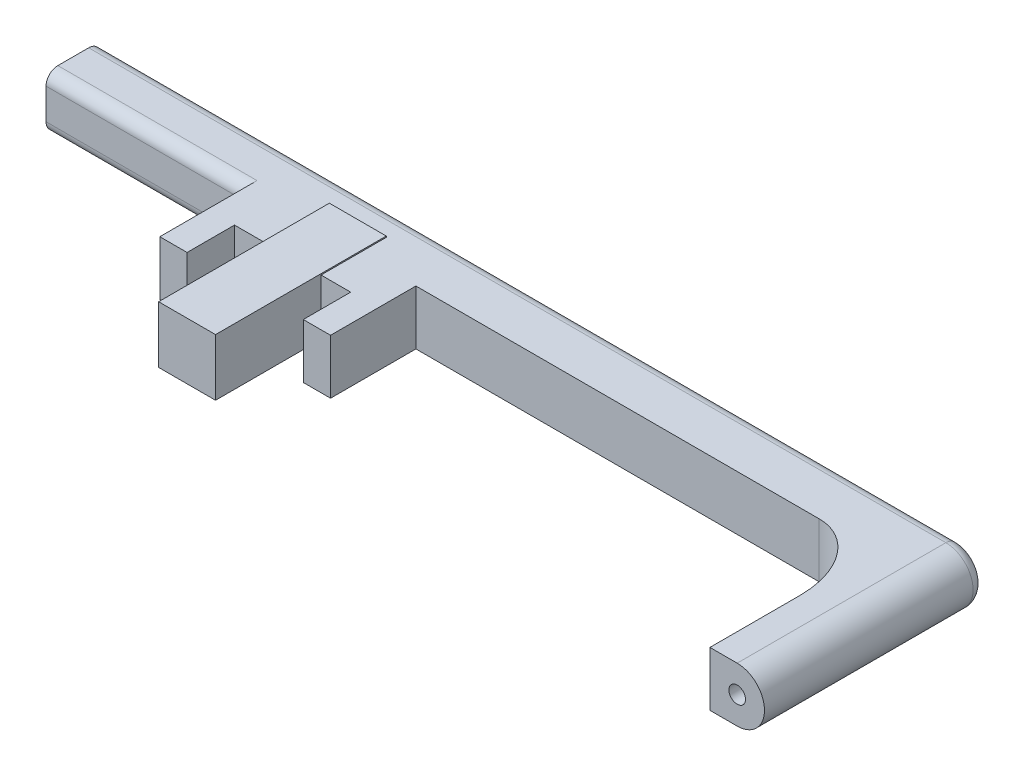
ISO-10303-21;
HEADER;
FILE_DESCRIPTION(('STEP AP214'),'2;1');
FILE_NAME('part.step','',(''),(''),'','','');
FILE_SCHEMA(('AUTOMOTIVE_DESIGN { 1 0 10303 214 1 1 1 1 }'));
ENDSEC;
DATA;
#1=APPLICATION_CONTEXT('core data for automotive mechanical design processes');
#2=APPLICATION_PROTOCOL_DEFINITION('international standard','automotive_design',2000,#1);
#3=PRODUCT_CONTEXT('',#1,'mechanical');
#4=PRODUCT('Part','Part','',(#3));
#5=PRODUCT_RELATED_PRODUCT_CATEGORY('part','',(#4));
#6=PRODUCT_DEFINITION_FORMATION('','',#4);
#7=PRODUCT_DEFINITION_CONTEXT('part definition',#1,'design');
#8=PRODUCT_DEFINITION('design','',#6,#7);
#9=PRODUCT_DEFINITION_SHAPE('','',#8);
#10=(LENGTH_UNIT() NAMED_UNIT(*) SI_UNIT(.MILLI.,.METRE.));
#11=(NAMED_UNIT(*) PLANE_ANGLE_UNIT() SI_UNIT($,.RADIAN.));
#12=(NAMED_UNIT(*) SI_UNIT($,.STERADIAN.) SOLID_ANGLE_UNIT());
#13=UNCERTAINTY_MEASURE_WITH_UNIT(LENGTH_MEASURE(1.E-05),#10,'distance_accuracy_value','');
#14=(GEOMETRIC_REPRESENTATION_CONTEXT(3) GLOBAL_UNCERTAINTY_ASSIGNED_CONTEXT((#13)) GLOBAL_UNIT_ASSIGNED_CONTEXT((#10,
#11,#12)) REPRESENTATION_CONTEXT('',''));
#15=CARTESIAN_POINT('',(0.,0.,0.));
#16=DIRECTION('',(0.,0.,1.));
#17=DIRECTION('',(1.,0.,0.));
#18=AXIS2_PLACEMENT_3D('',#15,#16,#17);
#19=CARTESIAN_POINT('',(1.2,-1.2,7.2));
#20=DIRECTION('',(-1.,0.,0.));
#21=DIRECTION('',(0.,0.,1.));
#22=AXIS2_PLACEMENT_3D('',#19,#20,#21);
#23=PLANE('',#22);
#24=DIRECTION('',(0.,-1.,0.));
#25=VECTOR('',#24,1.);
#26=CARTESIAN_POINT('',(1.2,-1.2,2.75));
#27=LINE('',#26,#25);
#28=CARTESIAN_POINT('',(1.2,1.15,2.75));
#29=VERTEX_POINT('',#28);
#30=CARTESIAN_POINT('',(1.2,-1.15,2.75));
#31=VERTEX_POINT('',#30);
#32=EDGE_CURVE('E527',#29,#31,#27,.T.);
#33=ORIENTED_EDGE('',*,*,#32,.F.);
#34=DIRECTION('',(0.,0.,-1.));
#35=VECTOR('',#34,1.);
#36=CARTESIAN_POINT('',(1.2,1.15,7.2));
#37=LINE('',#36,#35);
#38=CARTESIAN_POINT('',(1.2,1.15,0.));
#39=VERTEX_POINT('',#38);
#40=EDGE_CURVE('E249',#29,#39,#37,.T.);
#41=ORIENTED_EDGE('',*,*,#40,.T.);
#42=DIRECTION('',(0.,1.,0.));
#43=VECTOR('',#42,1.);
#44=CARTESIAN_POINT('',(1.2,-1.2,0.));
#45=LINE('',#44,#43);
#46=CARTESIAN_POINT('',(1.2,1.2,0.));
#47=VERTEX_POINT('',#46);
#48=EDGE_CURVE('E502',#39,#47,#45,.T.);
#49=ORIENTED_EDGE('',*,*,#48,.T.);
#50=DIRECTION('',(0.,0.,-1.));
#51=VECTOR('',#50,1.);
#52=CARTESIAN_POINT('',(1.2,1.2,7.2));
#53=LINE('',#52,#51);
#54=CARTESIAN_POINT('',(1.2,1.2,7.2));
#55=VERTEX_POINT('',#54);
#56=EDGE_CURVE('E477',#55,#47,#53,.T.);
#57=ORIENTED_EDGE('',*,*,#56,.F.);
#58=DIRECTION('',(0.,1.,0.));
#59=VECTOR('',#58,1.);
#60=CARTESIAN_POINT('',(1.2,-1.2,7.2));
#61=LINE('',#60,#59);
#62=CARTESIAN_POINT('',(1.2,-1.2,7.2));
#63=VERTEX_POINT('',#62);
#64=EDGE_CURVE('E493',#63,#55,#61,.T.);
#65=ORIENTED_EDGE('',*,*,#64,.F.);
#66=DIRECTION('',(0.,0.,-1.));
#67=VECTOR('',#66,1.);
#68=CARTESIAN_POINT('',(1.2,-1.2,7.2));
#69=LINE('',#68,#67);
#70=CARTESIAN_POINT('',(1.2,-1.2,0.));
#71=VERTEX_POINT('',#70);
#72=EDGE_CURVE('E487',#63,#71,#69,.T.);
#73=ORIENTED_EDGE('',*,*,#72,.T.);
#74=CARTESIAN_POINT('',(1.2,-1.15,0.));
#75=VERTEX_POINT('',#74);
#76=EDGE_CURVE('E499',#71,#75,#45,.T.);
#77=ORIENTED_EDGE('',*,*,#76,.T.);
#78=DIRECTION('',(0.,0.,1.));
#79=VECTOR('',#78,1.);
#80=CARTESIAN_POINT('',(1.2,-1.15,7.2));
#81=LINE('',#80,#79);
#82=EDGE_CURVE('E510',#75,#31,#81,.T.);
#83=ORIENTED_EDGE('',*,*,#82,.T.);
#84=EDGE_LOOP('',(#33,#41,#49,#57,#65,#73,#77,#83));
#85=FACE_BOUND('',#84,.T.);
#86=ADVANCED_FACE('F43',(#85),#23,.F.);
#87=CARTESIAN_POINT('',(-1.2,-1.2,7.2));
#88=DIRECTION('',(1.,0.,0.));
#89=DIRECTION('',(0.,0.,-1.));
#90=AXIS2_PLACEMENT_3D('',#87,#88,#89);
#91=PLANE('',#90);
#92=DIRECTION('',(0.,0.,1.));
#93=VECTOR('',#92,1.);
#94=CARTESIAN_POINT('',(-1.2,1.15,7.2));
#95=LINE('',#94,#93);
#96=CARTESIAN_POINT('',(-1.2,1.15,0.));
#97=VERTEX_POINT('',#96);
#98=CARTESIAN_POINT('',(-1.2,1.15,2.75));
#99=VERTEX_POINT('',#98);
#100=EDGE_CURVE('E61',#97,#99,#95,.T.);
#101=ORIENTED_EDGE('',*,*,#100,.T.);
#102=DIRECTION('',(0.,1.,0.));
#103=VECTOR('',#102,1.);
#104=CARTESIAN_POINT('',(-1.2,-1.2,2.75));
#105=LINE('',#104,#103);
#106=CARTESIAN_POINT('',(-1.2,-1.15,2.75));
#107=VERTEX_POINT('',#106);
#108=EDGE_CURVE('E529',#107,#99,#105,.T.);
#109=ORIENTED_EDGE('',*,*,#108,.F.);
#110=DIRECTION('',(0.,0.,-1.));
#111=VECTOR('',#110,1.);
#112=CARTESIAN_POINT('',(-1.2,-1.15,7.2));
#113=LINE('',#112,#111);
#114=CARTESIAN_POINT('',(-1.2,-1.15,0.));
#115=VERTEX_POINT('',#114);
#116=EDGE_CURVE('E69',#107,#115,#113,.T.);
#117=ORIENTED_EDGE('',*,*,#116,.T.);
#118=DIRECTION('',(0.,-1.,0.));
#119=VECTOR('',#118,1.);
#120=CARTESIAN_POINT('',(-1.2,-1.2,0.));
#121=LINE('',#120,#119);
#122=CARTESIAN_POINT('',(-1.2,-1.2,0.));
#123=VERTEX_POINT('',#122);
#124=EDGE_CURVE('E496',#115,#123,#121,.T.);
#125=ORIENTED_EDGE('',*,*,#124,.T.);
#126=DIRECTION('',(0.,0.,-1.));
#127=VECTOR('',#126,1.);
#128=CARTESIAN_POINT('',(-1.2,-1.2,7.2));
#129=LINE('',#128,#127);
#130=CARTESIAN_POINT('',(-1.2,-1.2,7.2));
#131=VERTEX_POINT('',#130);
#132=EDGE_CURVE('E484',#131,#123,#129,.T.);
#133=ORIENTED_EDGE('',*,*,#132,.F.);
#134=DIRECTION('',(0.,-1.,0.));
#135=VECTOR('',#134,1.);
#136=CARTESIAN_POINT('',(-1.2,-1.2,7.2));
#137=LINE('',#136,#135);
#138=CARTESIAN_POINT('',(-1.2,1.2,7.2));
#139=VERTEX_POINT('',#138);
#140=EDGE_CURVE('E504',#139,#131,#137,.T.);
#141=ORIENTED_EDGE('',*,*,#140,.F.);
#142=DIRECTION('',(0.,0.,-1.));
#143=VECTOR('',#142,1.);
#144=CARTESIAN_POINT('',(-1.2,1.2,7.2));
#145=LINE('',#144,#143);
#146=CARTESIAN_POINT('',(-1.2,1.2,0.));
#147=VERTEX_POINT('',#146);
#148=EDGE_CURVE('E479',#139,#147,#145,.T.);
#149=ORIENTED_EDGE('',*,*,#148,.T.);
#150=EDGE_CURVE('E494',#147,#97,#121,.T.);
#151=ORIENTED_EDGE('',*,*,#150,.T.);
#152=EDGE_LOOP('',(#101,#109,#117,#125,#133,#141,#149,#151));
#153=FACE_BOUND('',#152,.T.);
#154=ADVANCED_FACE('F605',(#153),#91,.F.);
#155=CARTESIAN_POINT('',(-2.45,0.,-0.65));
#156=DIRECTION('',(-1.,0.,0.));
#157=DIRECTION('',(0.,-1.,0.));
#158=AXIS2_PLACEMENT_3D('',#155,#156,#157);
#159=PLANE('',#158);
#160=DIRECTION('',(0.,-1.,0.));
#161=VECTOR('',#160,1.);
#162=CARTESIAN_POINT('',(-2.45,0.,2.75));
#163=LINE('',#162,#161);
#164=CARTESIAN_POINT('',(-2.45,1.15,2.75));
#165=VERTEX_POINT('',#164);
#166=CARTESIAN_POINT('',(-2.45,-1.15,2.75));
#167=VERTEX_POINT('',#166);
#168=EDGE_CURVE('E238',#165,#167,#163,.T.);
#169=ORIENTED_EDGE('',*,*,#168,.F.);
#170=DIRECTION('',(0.,0.,1.));
#171=VECTOR('',#170,1.);
#172=CARTESIAN_POINT('',(-2.45,1.15,-0.65));
#173=LINE('',#172,#171);
#174=CARTESIAN_POINT('',(-2.45,1.15,4.75));
#175=VERTEX_POINT('',#174);
#176=EDGE_CURVE('E284',#165,#175,#173,.T.);
#177=ORIENTED_EDGE('',*,*,#176,.T.);
#178=DIRECTION('',(0.,-1.,0.));
#179=VECTOR('',#178,1.);
#180=CARTESIAN_POINT('',(-2.45,0.,4.75));
#181=LINE('',#180,#179);
#182=CARTESIAN_POINT('',(-2.45,-1.15,4.75));
#183=VERTEX_POINT('',#182);
#184=EDGE_CURVE('E280',#175,#183,#181,.T.);
#185=ORIENTED_EDGE('',*,*,#184,.T.);
#186=DIRECTION('',(0.,0.,1.));
#187=VECTOR('',#186,1.);
#188=CARTESIAN_POINT('',(-2.45,-1.15,-0.65));
#189=LINE('',#188,#187);
#190=EDGE_CURVE('E287',#167,#183,#189,.T.);
#191=ORIENTED_EDGE('',*,*,#190,.F.);
#192=EDGE_LOOP('',(#169,#177,#185,#191));
#193=FACE_BOUND('',#192,.T.);
#194=ADVANCED_FACE('F541',(#193),#159,.F.);
#195=CARTESIAN_POINT('',(2.45,0.,4.75));
#196=DIRECTION('',(-1.,0.,0.));
#197=DIRECTION('',(0.,0.,1.));
#198=AXIS2_PLACEMENT_3D('',#195,#196,#197);
#199=PLANE('',#198);
#200=DIRECTION('',(0.,0.,-1.));
#201=VECTOR('',#200,1.);
#202=CARTESIAN_POINT('',(2.45,1.15,4.75));
#203=LINE('',#202,#201);
#204=CARTESIAN_POINT('',(2.45,1.15,4.75));
#205=VERTEX_POINT('',#204);
#206=CARTESIAN_POINT('',(2.45,1.15,2.75));
#207=VERTEX_POINT('',#206);
#208=EDGE_CURVE('E245',#205,#207,#203,.T.);
#209=ORIENTED_EDGE('',*,*,#208,.T.);
#210=DIRECTION('',(0.,-1.,0.));
#211=VECTOR('',#210,1.);
#212=CARTESIAN_POINT('',(2.45,0.,2.75));
#213=LINE('',#212,#211);
#214=CARTESIAN_POINT('',(2.45,-1.15,2.75));
#215=VERTEX_POINT('',#214);
#216=EDGE_CURVE('E227',#207,#215,#213,.T.);
#217=ORIENTED_EDGE('',*,*,#216,.T.);
#218=DIRECTION('',(0.,0.,-1.));
#219=VECTOR('',#218,1.);
#220=CARTESIAN_POINT('',(2.45,-1.15,4.75));
#221=LINE('',#220,#219);
#222=CARTESIAN_POINT('',(2.45,-1.15,4.75));
#223=VERTEX_POINT('',#222);
#224=EDGE_CURVE('E266',#223,#215,#221,.T.);
#225=ORIENTED_EDGE('',*,*,#224,.F.);
#226=DIRECTION('',(0.,1.,0.));
#227=VECTOR('',#226,1.);
#228=CARTESIAN_POINT('',(2.45,0.,4.75));
#229=LINE('',#228,#227);
#230=EDGE_CURVE('E254',#223,#205,#229,.T.);
#231=ORIENTED_EDGE('',*,*,#230,.T.);
#232=EDGE_LOOP('',(#209,#217,#225,#231));
#233=FACE_BOUND('',#232,.T.);
#234=ADVANCED_FACE('F252',(#233),#199,.T.);
#235=CARTESIAN_POINT('',(0.,0.,0.));
#236=DIRECTION('',(0.,0.,-1.));
#237=DIRECTION('',(-1.,0.,0.));
#238=AXIS2_PLACEMENT_3D('',#235,#236,#237);
#239=PLANE('',#238);
#240=DIRECTION('',(-1.,0.,0.));
#241=VECTOR('',#240,1.);
#242=CARTESIAN_POINT('',(0.,-1.15,0.));
#243=LINE('',#242,#241);
#244=EDGE_CURVE('E330',#75,#115,#243,.T.);
#245=ORIENTED_EDGE('',*,*,#244,.F.);
#246=ORIENTED_EDGE('',*,*,#76,.F.);
#247=DIRECTION('',(1.,0.,0.));
#248=VECTOR('',#247,1.);
#249=CARTESIAN_POINT('',(-1.2,-1.2,0.));
#250=LINE('',#249,#248);
#251=EDGE_CURVE('E491',#123,#71,#250,.T.);
#252=ORIENTED_EDGE('',*,*,#251,.F.);
#253=ORIENTED_EDGE('',*,*,#124,.F.);
#254=EDGE_LOOP('',(#245,#246,#252,#253));
#255=FACE_BOUND('',#254,.T.);
#256=ADVANCED_FACE('F615',(#255),#239,.T.);
#257=CARTESIAN_POINT('',(-1.2,1.2,7.2));
#258=DIRECTION('',(0.,-1.,0.));
#259=DIRECTION('',(0.,0.,-1.));
#260=AXIS2_PLACEMENT_3D('',#257,#258,#259);
#261=PLANE('',#260);
#262=DIRECTION('',(-1.,0.,0.));
#263=VECTOR('',#262,1.);
#264=CARTESIAN_POINT('',(-1.2,1.2,0.));
#265=LINE('',#264,#263);
#266=EDGE_CURVE('E497',#47,#147,#265,.T.);
#267=ORIENTED_EDGE('',*,*,#266,.T.);
#268=ORIENTED_EDGE('',*,*,#148,.F.);
#269=DIRECTION('',(-1.,0.,0.));
#270=VECTOR('',#269,1.);
#271=CARTESIAN_POINT('',(-1.2,1.2,7.2));
#272=LINE('',#271,#270);
#273=EDGE_CURVE('E506',#55,#139,#272,.T.);
#274=ORIENTED_EDGE('',*,*,#273,.F.);
#275=ORIENTED_EDGE('',*,*,#56,.T.);
#276=EDGE_LOOP('',(#267,#268,#274,#275));
#277=FACE_BOUND('',#276,.T.);
#278=ADVANCED_FACE('F631',(#277),#261,.F.);
#279=CARTESIAN_POINT('',(-1.2,-1.2,7.2));
#280=DIRECTION('',(0.,1.,0.));
#281=DIRECTION('',(0.,0.,1.));
#282=AXIS2_PLACEMENT_3D('',#279,#280,#281);
#283=PLANE('',#282);
#284=ORIENTED_EDGE('',*,*,#251,.T.);
#285=ORIENTED_EDGE('',*,*,#72,.F.);
#286=DIRECTION('',(1.,0.,0.));
#287=VECTOR('',#286,1.);
#288=CARTESIAN_POINT('',(-1.2,-1.2,7.2));
#289=LINE('',#288,#287);
#290=EDGE_CURVE('E490',#131,#63,#289,.T.);
#291=ORIENTED_EDGE('',*,*,#290,.F.);
#292=ORIENTED_EDGE('',*,*,#132,.T.);
#293=EDGE_LOOP('',(#284,#285,#291,#292));
#294=FACE_BOUND('',#293,.T.);
#295=ADVANCED_FACE('F621',(#294),#283,.F.);
#296=CARTESIAN_POINT('',(0.,0.,7.2));
#297=DIRECTION('',(0.,0.,-1.));
#298=DIRECTION('',(-1.,0.,0.));
#299=AXIS2_PLACEMENT_3D('',#296,#297,#298);
#300=PLANE('',#299);
#301=ORIENTED_EDGE('',*,*,#64,.T.);
#302=ORIENTED_EDGE('',*,*,#273,.T.);
#303=ORIENTED_EDGE('',*,*,#140,.T.);
#304=ORIENTED_EDGE('',*,*,#290,.T.);
#305=EDGE_LOOP('',(#301,#302,#303,#304));
#306=FACE_BOUND('',#305,.T.);
#307=ADVANCED_FACE('F623',(#306),#300,.F.);
#308=DIRECTION('',(1.,0.,0.));
#309=VECTOR('',#308,1.);
#310=CARTESIAN_POINT('',(0.,1.15,0.));
#311=LINE('',#310,#309);
#312=EDGE_CURVE('E475',#97,#39,#311,.T.);
#313=ORIENTED_EDGE('',*,*,#312,.F.);
#314=ORIENTED_EDGE('',*,*,#150,.F.);
#315=ORIENTED_EDGE('',*,*,#266,.F.);
#316=ORIENTED_EDGE('',*,*,#48,.F.);
#317=EDGE_LOOP('',(#313,#314,#315,#316));
#318=FACE_BOUND('',#317,.T.);
#319=ADVANCED_FACE('F630',(#318),#239,.T.);
#320=CARTESIAN_POINT('',(-12.,-1.15,1.15));
#321=DIRECTION('',(0.,0.,1.));
#322=DIRECTION('',(1.,0.,0.));
#323=AXIS2_PLACEMENT_3D('',#320,#321,#322);
#324=PLANE('',#323);
#325=DIRECTION('',(0.,1.,0.));
#326=VECTOR('',#325,1.);
#327=CARTESIAN_POINT('',(3.6,-1.15,1.15));
#328=LINE('',#327,#326);
#329=CARTESIAN_POINT('',(3.6,-1.15,1.15));
#330=VERTEX_POINT('',#329);
#331=CARTESIAN_POINT('',(3.6,1.15,1.15));
#332=VERTEX_POINT('',#331);
#333=EDGE_CURVE('E268',#330,#332,#328,.T.);
#334=ORIENTED_EDGE('',*,*,#333,.F.);
#335=DIRECTION('',(1.,0.,0.));
#336=VECTOR('',#335,1.);
#337=CARTESIAN_POINT('',(-12.,-1.15,1.15));
#338=LINE('',#337,#336);
#339=CARTESIAN_POINT('',(20.6,-1.15,1.15));
#340=VERTEX_POINT('',#339);
#341=EDGE_CURVE('E47',#330,#340,#338,.T.);
#342=ORIENTED_EDGE('',*,*,#341,.T.);
#343=CARTESIAN_POINT('',(20.6,1.265,1.15));
#344=CARTESIAN_POINT('',(20.6,0.421666666666668,1.15));
#345=CARTESIAN_POINT('',(20.6,-0.421666666666668,1.15));
#346=CARTESIAN_POINT('',(20.6,-1.265,1.15));
#347=(BOUNDED_CURVE() B_SPLINE_CURVE(3,(#343,#344,#345,#346),.UNSPECIFIED.,.F.,
.F.) B_SPLINE_CURVE_WITH_KNOTS((4,4),(-0.001265,0.001265),
.UNSPECIFIED.) CURVE() GEOMETRIC_REPRESENTATION_ITEM() RATIONAL_B_SPLINE_CURVE((1.,1.,1.,1.)) REPRESENTATION_ITEM(''));
#348=CARTESIAN_POINT('',(20.6,1.15,1.15));
#349=VERTEX_POINT('',#348);
#350=EDGE_CURVE('E462',#340,#349,#347,.F.);
#351=ORIENTED_EDGE('',*,*,#350,.T.);
#352=DIRECTION('',(1.,0.,0.));
#353=VECTOR('',#352,1.);
#354=CARTESIAN_POINT('',(-12.,1.15,1.15));
#355=LINE('',#354,#353);
#356=EDGE_CURVE('E352',#332,#349,#355,.T.);
#357=ORIENTED_EDGE('',*,*,#356,.F.);
#358=EDGE_LOOP('',(#334,#342,#351,#357));
#359=FACE_BOUND('',#358,.T.);
#360=ADVANCED_FACE('F514',(#359),#324,.T.);
#361=DIRECTION('',(0.,-1.,0.));
#362=VECTOR('',#361,1.);
#363=CARTESIAN_POINT('',(-3.6,-1.15,1.15));
#364=LINE('',#363,#362);
#365=CARTESIAN_POINT('',(-3.6,0.65,1.15));
#366=VERTEX_POINT('',#365);
#367=CARTESIAN_POINT('',(-3.6,-0.65,1.15));
#368=VERTEX_POINT('',#367);
#369=EDGE_CURVE('E286',#366,#368,#364,.T.);
#370=ORIENTED_EDGE('',*,*,#369,.F.);
#371=DIRECTION('',(1.,0.,0.));
#372=VECTOR('',#371,1.);
#373=CARTESIAN_POINT('',(-12.,0.65,1.15));
#374=LINE('',#373,#372);
#375=CARTESIAN_POINT('',(-12.,0.65,1.15));
#376=VERTEX_POINT('',#375);
#377=EDGE_CURVE('E370',#366,#376,#374,.F.);
#378=ORIENTED_EDGE('',*,*,#377,.T.);
#379=DIRECTION('',(0.,-1.,0.));
#380=VECTOR('',#379,1.);
#381=CARTESIAN_POINT('',(-12.,-1.15,1.15));
#382=LINE('',#381,#380);
#383=CARTESIAN_POINT('',(-12.,-0.65,1.15));
#384=VERTEX_POINT('',#383);
#385=EDGE_CURVE('E347',#376,#384,#382,.T.);
#386=ORIENTED_EDGE('',*,*,#385,.T.);
#387=DIRECTION('',(1.,0.,0.));
#388=VECTOR('',#387,1.);
#389=CARTESIAN_POINT('',(-12.,-0.65,1.15));
#390=LINE('',#389,#388);
#391=EDGE_CURVE('E367',#384,#368,#390,.T.);
#392=ORIENTED_EDGE('',*,*,#391,.T.);
#393=EDGE_LOOP('',(#370,#378,#386,#392));
#394=FACE_BOUND('',#393,.T.);
#395=ADVANCED_FACE('F563',(#394),#324,.T.);
#396=CARTESIAN_POINT('',(-12.,-1.15,1.15));
#397=DIRECTION('',(0.,-1.,0.));
#398=DIRECTION('',(0.,0.,-1.));
#399=AXIS2_PLACEMENT_3D('',#396,#397,#398);
#400=PLANE('',#399);
#401=DIRECTION('',(1.,0.,0.));
#402=VECTOR('',#401,1.);
#403=CARTESIAN_POINT('',(-12.,-1.15,-0.65));
#404=LINE('',#403,#402);
#405=CARTESIAN_POINT('',(-12.,-1.15,-0.65));
#406=VERTEX_POINT('',#405);
#407=CARTESIAN_POINT('',(24.15,-1.15,-0.65));
#408=VERTEX_POINT('',#407);
#409=EDGE_CURVE('E388',#406,#408,#404,.T.);
#410=ORIENTED_EDGE('',*,*,#409,.T.);
#411=DIRECTION('',(0.,0.,-1.));
#412=VECTOR('',#411,1.);
#413=CARTESIAN_POINT('',(24.15,-1.15,8.15));
#414=LINE('',#413,#412);
#415=CARTESIAN_POINT('',(24.15,-1.15,8.15));
#416=VERTEX_POINT('',#415);
#417=EDGE_CURVE('E337',#416,#408,#414,.T.);
#418=ORIENTED_EDGE('',*,*,#417,.F.);
#419=DIRECTION('',(1.,0.,0.));
#420=VECTOR('',#419,1.);
#421=CARTESIAN_POINT('',(23.,-1.15,8.15));
#422=LINE('',#421,#420);
#423=CARTESIAN_POINT('',(23.,-1.15,8.15));
#424=VERTEX_POINT('',#423);
#425=EDGE_CURVE('E314',#424,#416,#422,.T.);
#426=ORIENTED_EDGE('',*,*,#425,.F.);
#427=DIRECTION('',(0.,0.,-1.));
#428=VECTOR('',#427,1.);
#429=CARTESIAN_POINT('',(23.,-1.15,8.15));
#430=LINE('',#429,#428);
#431=CARTESIAN_POINT('',(23.,-1.15,4.35));
#432=VERTEX_POINT('',#431);
#433=EDGE_CURVE('E332',#424,#432,#430,.T.);
#434=ORIENTED_EDGE('',*,*,#433,.T.);
#435=CARTESIAN_POINT('',(20.6,-1.15,1.15));
#436=CARTESIAN_POINT('',(23.,-1.15,1.15));
#437=CARTESIAN_POINT('',(23.,-1.15,4.35));
#438=(BOUNDED_CURVE() B_SPLINE_CURVE(2,(#435,#436,#437),.UNSPECIFIED.,.F.,
.F.) B_SPLINE_CURVE_WITH_KNOTS((3,3),(0.,1.),
.UNSPECIFIED.) CURVE() GEOMETRIC_REPRESENTATION_ITEM() RATIONAL_B_SPLINE_CURVE((1.,
0.707106781186548,1.)) REPRESENTATION_ITEM(''));
#439=EDGE_CURVE('E466',#432,#340,#438,.F.);
#440=ORIENTED_EDGE('',*,*,#439,.T.);
#441=ORIENTED_EDGE('',*,*,#341,.F.);
#442=DIRECTION('',(0.,0.,-1.));
#443=VECTOR('',#442,1.);
#444=CARTESIAN_POINT('',(3.6,-1.15,4.75));
#445=LINE('',#444,#443);
#446=CARTESIAN_POINT('',(3.6,-1.15,4.75));
#447=VERTEX_POINT('',#446);
#448=EDGE_CURVE('E259',#447,#330,#445,.T.);
#449=ORIENTED_EDGE('',*,*,#448,.F.);
#450=DIRECTION('',(1.,0.,0.));
#451=VECTOR('',#450,1.);
#452=CARTESIAN_POINT('',(0.,-1.15,4.75));
#453=LINE('',#452,#451);
#454=EDGE_CURVE('E519',#223,#447,#453,.T.);
#455=ORIENTED_EDGE('',*,*,#454,.F.);
#456=ORIENTED_EDGE('',*,*,#224,.T.);
#457=DIRECTION('',(1.,0.,0.));
#458=VECTOR('',#457,1.);
#459=CARTESIAN_POINT('',(-3.6,-1.15,2.75));
#460=LINE('',#459,#458);
#461=EDGE_CURVE('E234',#31,#215,#460,.T.);
#462=ORIENTED_EDGE('',*,*,#461,.F.);
#463=ORIENTED_EDGE('',*,*,#82,.F.);
#464=ORIENTED_EDGE('',*,*,#244,.T.);
#465=ORIENTED_EDGE('',*,*,#116,.F.);
#466=EDGE_CURVE('E239',#167,#107,#460,.T.);
#467=ORIENTED_EDGE('',*,*,#466,.F.);
#468=ORIENTED_EDGE('',*,*,#190,.T.);
#469=DIRECTION('',(1.,0.,0.));
#470=VECTOR('',#469,1.);
#471=CARTESIAN_POINT('',(0.,-1.15,4.75));
#472=LINE('',#471,#470);
#473=CARTESIAN_POINT('',(-3.6,-1.15,4.75));
#474=VERTEX_POINT('',#473);
#475=EDGE_CURVE('E277',#474,#183,#472,.T.);
#476=ORIENTED_EDGE('',*,*,#475,.F.);
#477=DIRECTION('',(0.,0.,1.));
#478=VECTOR('',#477,1.);
#479=CARTESIAN_POINT('',(-3.6,-1.15,-0.65));
#480=LINE('',#479,#478);
#481=CARTESIAN_POINT('',(-3.6,-1.15,0.65));
#482=VERTEX_POINT('',#481);
#483=EDGE_CURVE('E289',#482,#474,#480,.T.);
#484=ORIENTED_EDGE('',*,*,#483,.F.);
#485=DIRECTION('',(1.,0.,0.));
#486=VECTOR('',#485,1.);
#487=CARTESIAN_POINT('',(-12.,-1.15,0.65));
#488=LINE('',#487,#486);
#489=CARTESIAN_POINT('',(-12.,-1.15,0.65));
#490=VERTEX_POINT('',#489);
#491=EDGE_CURVE('E390',#482,#490,#488,.F.);
#492=ORIENTED_EDGE('',*,*,#491,.T.);
#493=DIRECTION('',(0.,0.,-1.));
#494=VECTOR('',#493,1.);
#495=CARTESIAN_POINT('',(-12.,-1.15,1.15));
#496=LINE('',#495,#494);
#497=EDGE_CURVE('E350',#490,#406,#496,.T.);
#498=ORIENTED_EDGE('',*,*,#497,.T.);
#499=EDGE_LOOP('',(#410,#418,#426,#434,#440,#441,#449,#455,#456,#462,#463,#464,#465,#467,#468,
#476,#484,#492,#498));
#500=FACE_BOUND('',#499,.T.);
#501=ADVANCED_FACE('F516',(#500),#400,.T.);
#502=CARTESIAN_POINT('',(-12.,1.15,1.15));
#503=DIRECTION('',(0.,1.,0.));
#504=DIRECTION('',(0.,0.,1.));
#505=AXIS2_PLACEMENT_3D('',#502,#503,#504);
#506=PLANE('',#505);
#507=DIRECTION('',(-1.,0.,0.));
#508=VECTOR('',#507,1.);
#509=CARTESIAN_POINT('',(-3.6,1.15,2.75));
#510=LINE('',#509,#508);
#511=EDGE_CURVE('E250',#99,#165,#510,.T.);
#512=ORIENTED_EDGE('',*,*,#511,.F.);
#513=ORIENTED_EDGE('',*,*,#100,.F.);
#514=ORIENTED_EDGE('',*,*,#312,.T.);
#515=ORIENTED_EDGE('',*,*,#40,.F.);
#516=EDGE_CURVE('E231',#207,#29,#510,.T.);
#517=ORIENTED_EDGE('',*,*,#516,.F.);
#518=ORIENTED_EDGE('',*,*,#208,.F.);
#519=DIRECTION('',(1.,0.,0.));
#520=VECTOR('',#519,1.);
#521=CARTESIAN_POINT('',(0.,1.15,4.75));
#522=LINE('',#521,#520);
#523=CARTESIAN_POINT('',(3.6,1.15,4.75));
#524=VERTEX_POINT('',#523);
#525=EDGE_CURVE('E257',#205,#524,#522,.T.);
#526=ORIENTED_EDGE('',*,*,#525,.T.);
#527=DIRECTION('',(0.,0.,-1.));
#528=VECTOR('',#527,1.);
#529=CARTESIAN_POINT('',(3.6,1.15,4.75));
#530=LINE('',#529,#528);
#531=EDGE_CURVE('E256',#524,#332,#530,.T.);
#532=ORIENTED_EDGE('',*,*,#531,.T.);
#533=ORIENTED_EDGE('',*,*,#356,.T.);
#534=CARTESIAN_POINT('',(23.,1.15,4.35));
#535=CARTESIAN_POINT('',(23.,1.15,1.15));
#536=CARTESIAN_POINT('',(20.6,1.15,1.15));
#537=(BOUNDED_CURVE() B_SPLINE_CURVE(2,(#534,#535,#536),.UNSPECIFIED.,.F.,
.F.) B_SPLINE_CURVE_WITH_KNOTS((3,3),(0.,1.),
.UNSPECIFIED.) CURVE() GEOMETRIC_REPRESENTATION_ITEM() RATIONAL_B_SPLINE_CURVE((1.,
0.707106781186548,1.)) REPRESENTATION_ITEM(''));
#538=CARTESIAN_POINT('',(23.,1.15,4.35));
#539=VERTEX_POINT('',#538);
#540=EDGE_CURVE('E392',#349,#539,#537,.F.);
#541=ORIENTED_EDGE('',*,*,#540,.T.);
#542=DIRECTION('',(0.,0.,-1.));
#543=VECTOR('',#542,1.);
#544=CARTESIAN_POINT('',(23.,1.15,8.15));
#545=LINE('',#544,#543);
#546=CARTESIAN_POINT('',(23.,1.15,8.15));
#547=VERTEX_POINT('',#546);
#548=EDGE_CURVE('E321',#547,#539,#545,.T.);
#549=ORIENTED_EDGE('',*,*,#548,.F.);
#550=DIRECTION('',(-1.,0.,0.));
#551=VECTOR('',#550,1.);
#552=CARTESIAN_POINT('',(23.,1.15,8.15));
#553=LINE('',#552,#551);
#554=CARTESIAN_POINT('',(24.15,1.15,8.15));
#555=VERTEX_POINT('',#554);
#556=EDGE_CURVE('E318',#555,#547,#553,.T.);
#557=ORIENTED_EDGE('',*,*,#556,.F.);
#558=DIRECTION('',(0.,0.,-1.));
#559=VECTOR('',#558,1.);
#560=CARTESIAN_POINT('',(24.15,1.15,8.15));
#561=LINE('',#560,#559);
#562=CARTESIAN_POINT('',(24.15,1.15,-0.65));
#563=VERTEX_POINT('',#562);
#564=EDGE_CURVE('E324',#555,#563,#561,.T.);
#565=ORIENTED_EDGE('',*,*,#564,.T.);
#566=DIRECTION('',(1.,0.,0.));
#567=VECTOR('',#566,1.);
#568=CARTESIAN_POINT('',(-12.,1.15,-0.65));
#569=LINE('',#568,#567);
#570=CARTESIAN_POINT('',(-12.,1.15,-0.65));
#571=VERTEX_POINT('',#570);
#572=EDGE_CURVE('E365',#563,#571,#569,.F.);
#573=ORIENTED_EDGE('',*,*,#572,.T.);
#574=DIRECTION('',(0.,0.,1.));
#575=VECTOR('',#574,1.);
#576=CARTESIAN_POINT('',(-12.,1.15,1.15));
#577=LINE('',#576,#575);
#578=CARTESIAN_POINT('',(-12.,1.15,0.65));
#579=VERTEX_POINT('',#578);
#580=EDGE_CURVE('E344',#571,#579,#577,.T.);
#581=ORIENTED_EDGE('',*,*,#580,.T.);
#582=DIRECTION('',(1.,0.,0.));
#583=VECTOR('',#582,1.);
#584=CARTESIAN_POINT('',(-12.,1.15,0.65));
#585=LINE('',#584,#583);
#586=CARTESIAN_POINT('',(-3.6,1.15,0.65));
#587=VERTEX_POINT('',#586);
#588=EDGE_CURVE('E53',#579,#587,#585,.T.);
#589=ORIENTED_EDGE('',*,*,#588,.T.);
#590=DIRECTION('',(0.,0.,1.));
#591=VECTOR('',#590,1.);
#592=CARTESIAN_POINT('',(-3.6,1.15,-0.65));
#593=LINE('',#592,#591);
#594=CARTESIAN_POINT('',(-3.6,1.15,4.75));
#595=VERTEX_POINT('',#594);
#596=EDGE_CURVE('E283',#587,#595,#593,.T.);
#597=ORIENTED_EDGE('',*,*,#596,.T.);
#598=DIRECTION('',(1.,0.,0.));
#599=VECTOR('',#598,1.);
#600=CARTESIAN_POINT('',(0.,1.15,4.75));
#601=LINE('',#600,#599);
#602=EDGE_CURVE('E271',#595,#175,#601,.T.);
#603=ORIENTED_EDGE('',*,*,#602,.T.);
#604=ORIENTED_EDGE('',*,*,#176,.F.);
#605=EDGE_LOOP('',(#512,#513,#514,#515,#517,#518,#526,#532,#533,#541,#549,#557,#565,#573,#581,
#589,#597,#603,#604));
#606=FACE_BOUND('',#605,.T.);
#607=ADVANCED_FACE('F243',(#606),#506,.T.);
#608=CARTESIAN_POINT('',(-12.,-1.15,-1.15));
#609=DIRECTION('',(0.,0.,-1.));
#610=DIRECTION('',(-1.,0.,0.));
#611=AXIS2_PLACEMENT_3D('',#608,#609,#610);
#612=PLANE('',#611);
#613=CARTESIAN_POINT('',(24.15,0.,-1.15));
#614=DIRECTION('',(0.,0.,-1.));
#615=DIRECTION('',(-1.,0.,0.));
#616=AXIS2_PLACEMENT_3D('',#613,#614,#615);
#617=CIRCLE('',#616,0.65);
#618=CARTESIAN_POINT('',(24.15,0.65,-1.15));
#619=VERTEX_POINT('',#618);
#620=CARTESIAN_POINT('',(24.15,-0.65,-1.15));
#621=VERTEX_POINT('',#620);
#622=EDGE_CURVE('E384',#619,#621,#617,.T.);
#623=ORIENTED_EDGE('',*,*,#622,.T.);
#624=DIRECTION('',(1.,0.,0.));
#625=VECTOR('',#624,1.);
#626=CARTESIAN_POINT('',(-12.,-0.65,-1.15));
#627=LINE('',#626,#625);
#628=CARTESIAN_POINT('',(-12.,-0.65,-1.15));
#629=VERTEX_POINT('',#628);
#630=EDGE_CURVE('E382',#621,#629,#627,.F.);
#631=ORIENTED_EDGE('',*,*,#630,.T.);
#632=DIRECTION('',(0.,1.,0.));
#633=VECTOR('',#632,1.);
#634=CARTESIAN_POINT('',(-12.,-1.15,-1.15));
#635=LINE('',#634,#633);
#636=CARTESIAN_POINT('',(-12.,0.65,-1.15));
#637=VERTEX_POINT('',#636);
#638=EDGE_CURVE('E336',#629,#637,#635,.T.);
#639=ORIENTED_EDGE('',*,*,#638,.T.);
#640=DIRECTION('',(1.,0.,0.));
#641=VECTOR('',#640,1.);
#642=CARTESIAN_POINT('',(-12.,0.65,-1.15));
#643=LINE('',#642,#641);
#644=EDGE_CURVE('E386',#637,#619,#643,.T.);
#645=ORIENTED_EDGE('',*,*,#644,.T.);
#646=EDGE_LOOP('',(#623,#631,#639,#645));
#647=FACE_BOUND('',#646,.T.);
#648=CARTESIAN_POINT('',(24.15,0.,-1.15));
#649=DIRECTION('',(0.,0.,-1.));
#650=DIRECTION('',(-1.,0.,0.));
#651=AXIS2_PLACEMENT_3D('',#648,#649,#650);
#652=CIRCLE('',#651,0.350000000000001);
#653=CARTESIAN_POINT('',(23.8,0.,-1.15));
#654=VERTEX_POINT('',#653);
#655=EDGE_CURVE('E304',#654,#654,#652,.F.);
#656=ORIENTED_EDGE('',*,*,#655,.T.);
#657=EDGE_LOOP('',(#656));
#658=FACE_BOUND('',#657,.T.);
#659=ADVANCED_FACE('F576',(#647,#658),#612,.T.);
#660=CARTESIAN_POINT('',(-12.,0.,0.));
#661=DIRECTION('',(-1.,0.,0.));
#662=DIRECTION('',(0.,0.,1.));
#663=AXIS2_PLACEMENT_3D('',#660,#661,#662);
#664=PLANE('',#663);
#665=CARTESIAN_POINT('',(-12.,0.,0.));
#666=DIRECTION('',(-1.,0.,0.));
#667=DIRECTION('',(0.,0.,1.));
#668=AXIS2_PLACEMENT_3D('',#665,#666,#667);
#669=CIRCLE('',#668,0.35);
#670=CARTESIAN_POINT('',(-12.,0.,0.35));
#671=VERTEX_POINT('',#670);
#672=EDGE_CURVE('E301',#671,#671,#669,.T.);
#673=ORIENTED_EDGE('',*,*,#672,.F.);
#674=EDGE_LOOP('',(#673));
#675=FACE_BOUND('',#674,.T.);
#676=ORIENTED_EDGE('',*,*,#638,.F.);
#677=CARTESIAN_POINT('',(-12.,-0.65,-0.65));
#678=DIRECTION('',(-1.,0.,0.));
#679=DIRECTION('',(0.,0.,1.));
#680=AXIS2_PLACEMENT_3D('',#677,#678,#679);
#681=CIRCLE('',#680,0.5);
#682=EDGE_CURVE('E374',#629,#406,#681,.T.);
#683=ORIENTED_EDGE('',*,*,#682,.T.);
#684=ORIENTED_EDGE('',*,*,#497,.F.);
#685=CARTESIAN_POINT('',(-12.,-0.65,0.65));
#686=DIRECTION('',(-1.,0.,0.));
#687=DIRECTION('',(0.,0.,1.));
#688=AXIS2_PLACEMENT_3D('',#685,#686,#687);
#689=CIRCLE('',#688,0.5);
#690=EDGE_CURVE('E376',#490,#384,#689,.T.);
#691=ORIENTED_EDGE('',*,*,#690,.T.);
#692=ORIENTED_EDGE('',*,*,#385,.F.);
#693=CARTESIAN_POINT('',(-12.,0.65,0.65));
#694=DIRECTION('',(-1.,0.,0.));
#695=DIRECTION('',(0.,0.,1.));
#696=AXIS2_PLACEMENT_3D('',#693,#694,#695);
#697=CIRCLE('',#696,0.5);
#698=EDGE_CURVE('E378',#376,#579,#697,.T.);
#699=ORIENTED_EDGE('',*,*,#698,.T.);
#700=ORIENTED_EDGE('',*,*,#580,.F.);
#701=CARTESIAN_POINT('',(-12.,0.65,-0.65));
#702=DIRECTION('',(-1.,0.,0.));
#703=DIRECTION('',(0.,0.,1.));
#704=AXIS2_PLACEMENT_3D('',#701,#702,#703);
#705=CIRCLE('',#704,0.5);
#706=EDGE_CURVE('E380',#571,#637,#705,.T.);
#707=ORIENTED_EDGE('',*,*,#706,.T.);
#708=EDGE_LOOP('',(#676,#683,#684,#691,#692,#699,#700,#707));
#709=FACE_BOUND('',#708,.T.);
#710=ADVANCED_FACE('F556',(#675,#709),#664,.T.);
#711=CARTESIAN_POINT('',(23.,0.,8.15));
#712=DIRECTION('',(1.,0.,0.));
#713=DIRECTION('',(0.,0.,-1.));
#714=AXIS2_PLACEMENT_3D('',#711,#712,#713);
#715=PLANE('',#714);
#716=ORIENTED_EDGE('',*,*,#548,.T.);
#717=CARTESIAN_POINT('',(23.,-1.265,4.35));
#718=CARTESIAN_POINT('',(23.,-0.421666666666668,4.35));
#719=CARTESIAN_POINT('',(23.,0.421666666666668,4.35));
#720=CARTESIAN_POINT('',(23.,1.265,4.35));
#721=(BOUNDED_CURVE() B_SPLINE_CURVE(3,(#717,#718,#719,#720),.UNSPECIFIED.,.F.,
.F.) B_SPLINE_CURVE_WITH_KNOTS((4,4),(-0.001265,0.001265),
.UNSPECIFIED.) CURVE() GEOMETRIC_REPRESENTATION_ITEM() RATIONAL_B_SPLINE_CURVE((1.,1.,1.,1.)) REPRESENTATION_ITEM(''));
#722=EDGE_CURVE('E463',#539,#432,#721,.F.);
#723=ORIENTED_EDGE('',*,*,#722,.T.);
#724=ORIENTED_EDGE('',*,*,#433,.F.);
#725=DIRECTION('',(0.,-1.,0.));
#726=VECTOR('',#725,1.);
#727=CARTESIAN_POINT('',(23.,0.,8.15));
#728=LINE('',#727,#726);
#729=EDGE_CURVE('E311',#547,#424,#728,.T.);
#730=ORIENTED_EDGE('',*,*,#729,.F.);
#731=EDGE_LOOP('',(#716,#723,#724,#730));
#732=FACE_BOUND('',#731,.T.);
#733=ADVANCED_FACE('F592',(#732),#715,.F.);
#734=CARTESIAN_POINT('',(24.15,0.,8.15));
#735=DIRECTION('',(0.,0.,1.));
#736=DIRECTION('',(1.,0.,0.));
#737=AXIS2_PLACEMENT_3D('',#734,#735,#736);
#738=PLANE('',#737);
#739=ORIENTED_EDGE('',*,*,#729,.T.);
#740=ORIENTED_EDGE('',*,*,#425,.T.);
#741=CARTESIAN_POINT('',(24.15,0.,8.15));
#742=DIRECTION('',(0.,0.,1.));
#743=DIRECTION('',(1.,0.,0.));
#744=AXIS2_PLACEMENT_3D('',#741,#742,#743);
#745=CIRCLE('',#744,1.15);
#746=EDGE_CURVE('E316',#416,#555,#745,.T.);
#747=ORIENTED_EDGE('',*,*,#746,.T.);
#748=ORIENTED_EDGE('',*,*,#556,.T.);
#749=EDGE_LOOP('',(#739,#740,#747,#748));
#750=FACE_BOUND('',#749,.T.);
#751=CARTESIAN_POINT('',(24.15,0.,8.15));
#752=DIRECTION('',(0.,0.,1.));
#753=DIRECTION('',(1.,0.,0.));
#754=AXIS2_PLACEMENT_3D('',#751,#752,#753);
#755=CIRCLE('',#754,0.350000000000001);
#756=CARTESIAN_POINT('',(24.5,0.,8.15));
#757=VERTEX_POINT('',#756);
#758=EDGE_CURVE('E308',#757,#757,#755,.T.);
#759=ORIENTED_EDGE('',*,*,#758,.F.);
#760=EDGE_LOOP('',(#759));
#761=FACE_BOUND('',#760,.T.);
#762=ADVANCED_FACE('F590',(#750,#761),#738,.T.);
#763=CARTESIAN_POINT('',(24.15,0.,8.15));
#764=DIRECTION('',(0.,0.,-1.));
#765=DIRECTION('',(-1.,0.,0.));
#766=AXIS2_PLACEMENT_3D('',#763,#764,#765);
#767=CYLINDRICAL_SURFACE('',#766,1.15);
#768=ORIENTED_EDGE('',*,*,#417,.T.);
#769=CARTESIAN_POINT('',(24.15,0.,-0.65));
#770=DIRECTION('',(0.,0.,-1.));
#771=DIRECTION('',(-1.,0.,0.));
#772=AXIS2_PLACEMENT_3D('',#769,#770,#771);
#773=CIRCLE('',#772,1.15);
#774=EDGE_CURVE('E372',#408,#563,#773,.F.);
#775=ORIENTED_EDGE('',*,*,#774,.T.);
#776=ORIENTED_EDGE('',*,*,#564,.F.);
#777=ORIENTED_EDGE('',*,*,#746,.F.);
#778=EDGE_LOOP('',(#768,#775,#776,#777));
#779=FACE_BOUND('',#778,.T.);
#780=ADVANCED_FACE('F587',(#779),#767,.T.);
#781=CARTESIAN_POINT('',(24.15,0.,8.15));
#782=DIRECTION('',(0.,0.,-1.));
#783=DIRECTION('',(-1.,0.,0.));
#784=AXIS2_PLACEMENT_3D('',#781,#782,#783);
#785=CYLINDRICAL_SURFACE('',#784,0.350000000000001);
#786=ORIENTED_EDGE('',*,*,#758,.T.);
#787=EDGE_LOOP('',(#786));
#788=FACE_BOUND('',#787,.T.);
#789=ORIENTED_EDGE('',*,*,#655,.F.);
#790=EDGE_LOOP('',(#789));
#791=FACE_BOUND('',#790,.T.);
#792=ADVANCED_FACE('F670',(#788,#791),#785,.F.);
#793=CARTESIAN_POINT('',(-2.,0.,0.));
#794=DIRECTION('',(-1.,0.,0.));
#795=DIRECTION('',(0.,0.,1.));
#796=AXIS2_PLACEMENT_3D('',#793,#794,#795);
#797=CYLINDRICAL_SURFACE('',#796,0.35);
#798=CARTESIAN_POINT('',(-3.6,0.,0.));
#799=DIRECTION('',(-1.,0.,0.));
#800=DIRECTION('',(0.,-1.,0.));
#801=AXIS2_PLACEMENT_3D('',#798,#799,#800);
#802=CIRCLE('',#801,0.35);
#803=CARTESIAN_POINT('',(-3.6,-0.35,0.));
#804=VERTEX_POINT('',#803);
#805=EDGE_CURVE('E297',#804,#804,#802,.F.);
#806=ORIENTED_EDGE('',*,*,#805,.T.);
#807=EDGE_LOOP('',(#806));
#808=FACE_BOUND('',#807,.T.);
#809=ORIENTED_EDGE('',*,*,#672,.T.);
#810=EDGE_LOOP('',(#809));
#811=FACE_BOUND('',#810,.T.);
#812=ADVANCED_FACE('F414',(#808,#811),#797,.F.);
#813=CARTESIAN_POINT('',(23.,1.265,4.35));
#814=CARTESIAN_POINT('',(23.,0.421666666666668,4.35));
#815=CARTESIAN_POINT('',(23.,-0.421666666666668,4.35));
#816=CARTESIAN_POINT('',(23.,-1.265,4.35));
#817=CARTESIAN_POINT('',(23.,1.265,1.15));
#818=CARTESIAN_POINT('',(23.,0.421666666666668,1.15));
#819=CARTESIAN_POINT('',(23.,-0.421666666666668,1.15));
#820=CARTESIAN_POINT('',(23.,-1.265,1.15));
#821=CARTESIAN_POINT('',(20.6,1.265,1.15));
#822=CARTESIAN_POINT('',(20.6,0.421666666666668,1.15));
#823=CARTESIAN_POINT('',(20.6,-0.421666666666668,1.15));
#824=CARTESIAN_POINT('',(20.6,-1.265,1.15));
#825=(BOUNDED_SURFACE() B_SPLINE_SURFACE(2,3,((#813,#814,#815,#816),(#817,#818,#819,#820),(#821,
#822,#823,#824)),.UNSPECIFIED.,.F.,.F.,.F.) B_SPLINE_SURFACE_WITH_KNOTS((3,3),(4,4),(0.,1.),
(-0.001265,0.001265),
.UNSPECIFIED.) GEOMETRIC_REPRESENTATION_ITEM() RATIONAL_B_SPLINE_SURFACE(((1.,1.,1.,1.),
(0.707106781186548,0.707106781186548,0.707106781186548,0.707106781186548),(1.,1.,1.,1.))) REPRESENTATION_ITEM('') SURFACE());
#826=ORIENTED_EDGE('',*,*,#540,.F.);
#827=ORIENTED_EDGE('',*,*,#350,.F.);
#828=ORIENTED_EDGE('',*,*,#439,.F.);
#829=ORIENTED_EDGE('',*,*,#722,.F.);
#830=EDGE_LOOP('',(#826,#827,#828,#829));
#831=FACE_BOUND('',#830,.T.);
#832=ADVANCED_FACE('F399',(#831),#825,.T.);
#833=CARTESIAN_POINT('',(-12.,0.65,-0.65));
#834=DIRECTION('',(1.,0.,0.));
#835=DIRECTION('',(0.,0.,-1.));
#836=AXIS2_PLACEMENT_3D('',#833,#834,#835);
#837=CYLINDRICAL_SURFACE('',#836,0.5);
#838=ORIENTED_EDGE('',*,*,#706,.F.);
#839=ORIENTED_EDGE('',*,*,#572,.F.);
#840=CARTESIAN_POINT('',(24.15,0.65,-0.65));
#841=DIRECTION('',(1.,0.,0.));
#842=DIRECTION('',(0.,0.,-1.));
#843=AXIS2_PLACEMENT_3D('',#840,#841,#842);
#844=CIRCLE('',#843,0.5);
#845=EDGE_CURVE('E305',#619,#563,#844,.T.);
#846=ORIENTED_EDGE('',*,*,#845,.F.);
#847=ORIENTED_EDGE('',*,*,#644,.F.);
#848=EDGE_LOOP('',(#838,#839,#846,#847));
#849=FACE_BOUND('',#848,.T.);
#850=ADVANCED_FACE('F413',(#849),#837,.T.);
#851=CARTESIAN_POINT('',(24.15,0.,-0.65));
#852=DIRECTION('',(0.,0.,-1.));
#853=DIRECTION('',(-1.,0.,0.));
#854=AXIS2_PLACEMENT_3D('',#851,#852,#853);
#855=TOROIDAL_SURFACE('',#854,0.65,0.5);
#856=ORIENTED_EDGE('',*,*,#845,.T.);
#857=ORIENTED_EDGE('',*,*,#774,.F.);
#858=CARTESIAN_POINT('',(24.15,-0.65,-0.65));
#859=DIRECTION('',(-1.,0.,0.));
#860=DIRECTION('',(0.,0.,1.));
#861=AXIS2_PLACEMENT_3D('',#858,#859,#860);
#862=CIRCLE('',#861,0.5);
#863=EDGE_CURVE('E300',#621,#408,#862,.T.);
#864=ORIENTED_EDGE('',*,*,#863,.F.);
#865=ORIENTED_EDGE('',*,*,#622,.F.);
#866=EDGE_LOOP('',(#856,#857,#864,#865));
#867=FACE_BOUND('',#866,.T.);
#868=ADVANCED_FACE('F734',(#867),#855,.T.);
#869=CARTESIAN_POINT('',(-12.,-0.65,-0.65));
#870=DIRECTION('',(1.,0.,0.));
#871=DIRECTION('',(0.,0.,-1.));
#872=AXIS2_PLACEMENT_3D('',#869,#870,#871);
#873=CYLINDRICAL_SURFACE('',#872,0.5);
#874=ORIENTED_EDGE('',*,*,#682,.F.);
#875=ORIENTED_EDGE('',*,*,#630,.F.);
#876=ORIENTED_EDGE('',*,*,#863,.T.);
#877=ORIENTED_EDGE('',*,*,#409,.F.);
#878=EDGE_LOOP('',(#874,#875,#876,#877));
#879=FACE_BOUND('',#878,.T.);
#880=ADVANCED_FACE('F417',(#879),#873,.T.);
#881=CARTESIAN_POINT('',(-12.,-0.65,0.65));
#882=DIRECTION('',(1.,0.,0.));
#883=DIRECTION('',(0.,0.,-1.));
#884=AXIS2_PLACEMENT_3D('',#881,#882,#883);
#885=CYLINDRICAL_SURFACE('',#884,0.5);
#886=CARTESIAN_POINT('',(-3.6,-0.65,0.65));
#887=DIRECTION('',(-1.,0.,0.));
#888=DIRECTION('',(0.,-1.,0.));
#889=AXIS2_PLACEMENT_3D('',#886,#887,#888);
#890=CIRCLE('',#889,0.5);
#891=EDGE_CURVE('E294',#368,#482,#890,.F.);
#892=ORIENTED_EDGE('',*,*,#891,.F.);
#893=ORIENTED_EDGE('',*,*,#391,.F.);
#894=ORIENTED_EDGE('',*,*,#690,.F.);
#895=ORIENTED_EDGE('',*,*,#491,.F.);
#896=EDGE_LOOP('',(#892,#893,#894,#895));
#897=FACE_BOUND('',#896,.T.);
#898=ADVANCED_FACE('F560',(#897),#885,.T.);
#899=CARTESIAN_POINT('',(-12.,0.65,0.65));
#900=DIRECTION('',(1.,0.,0.));
#901=DIRECTION('',(0.,0.,-1.));
#902=AXIS2_PLACEMENT_3D('',#899,#900,#901);
#903=CYLINDRICAL_SURFACE('',#902,0.5);
#904=CARTESIAN_POINT('',(-3.6,0.65,0.65));
#905=DIRECTION('',(-1.,0.,0.));
#906=DIRECTION('',(0.,-1.,0.));
#907=AXIS2_PLACEMENT_3D('',#904,#905,#906);
#908=CIRCLE('',#907,0.5);
#909=EDGE_CURVE('E12',#587,#366,#908,.F.);
#910=ORIENTED_EDGE('',*,*,#909,.F.);
#911=ORIENTED_EDGE('',*,*,#588,.F.);
#912=ORIENTED_EDGE('',*,*,#698,.F.);
#913=ORIENTED_EDGE('',*,*,#377,.F.);
#914=EDGE_LOOP('',(#910,#911,#912,#913));
#915=FACE_BOUND('',#914,.T.);
#916=ADVANCED_FACE('F45',(#915),#903,.T.);
#917=CARTESIAN_POINT('',(0.,0.,4.75));
#918=DIRECTION('',(0.,0.,1.));
#919=DIRECTION('',(1.,0.,0.));
#920=AXIS2_PLACEMENT_3D('',#917,#918,#919);
#921=PLANE('',#920);
#922=ORIENTED_EDGE('',*,*,#602,.F.);
#923=DIRECTION('',(0.,-1.,0.));
#924=VECTOR('',#923,1.);
#925=CARTESIAN_POINT('',(-3.6,0.,4.75));
#926=LINE('',#925,#924);
#927=EDGE_CURVE('E274',#595,#474,#926,.T.);
#928=ORIENTED_EDGE('',*,*,#927,.T.);
#929=ORIENTED_EDGE('',*,*,#475,.T.);
#930=ORIENTED_EDGE('',*,*,#184,.F.);
#931=EDGE_LOOP('',(#922,#928,#929,#930));
#932=FACE_BOUND('',#931,.T.);
#933=ADVANCED_FACE('F545',(#932),#921,.T.);
#934=CARTESIAN_POINT('',(-3.6,0.,-0.65));
#935=DIRECTION('',(-1.,0.,0.));
#936=DIRECTION('',(0.,-1.,0.));
#937=AXIS2_PLACEMENT_3D('',#934,#935,#936);
#938=PLANE('',#937);
#939=ORIENTED_EDGE('',*,*,#483,.T.);
#940=ORIENTED_EDGE('',*,*,#927,.F.);
#941=ORIENTED_EDGE('',*,*,#596,.F.);
#942=ORIENTED_EDGE('',*,*,#909,.T.);
#943=ORIENTED_EDGE('',*,*,#369,.T.);
#944=ORIENTED_EDGE('',*,*,#891,.T.);
#945=EDGE_LOOP('',(#939,#940,#941,#942,#943,#944));
#946=FACE_BOUND('',#945,.T.);
#947=ADVANCED_FACE('F549',(#946),#938,.T.);
#948=ORIENTED_EDGE('',*,*,#805,.F.);
#949=EDGE_LOOP('',(#948));
#950=FACE_BOUND('',#949,.T.);
#951=ADVANCED_FACE('F685',(#950),#938,.T.);
#952=CARTESIAN_POINT('',(3.6,0.,4.75));
#953=DIRECTION('',(1.,0.,0.));
#954=DIRECTION('',(0.,0.,-1.));
#955=AXIS2_PLACEMENT_3D('',#952,#953,#954);
#956=PLANE('',#955);
#957=ORIENTED_EDGE('',*,*,#333,.T.);
#958=ORIENTED_EDGE('',*,*,#531,.F.);
#959=DIRECTION('',(0.,-1.,0.));
#960=VECTOR('',#959,1.);
#961=CARTESIAN_POINT('',(3.6,0.,4.75));
#962=LINE('',#961,#960);
#963=EDGE_CURVE('E261',#524,#447,#962,.T.);
#964=ORIENTED_EDGE('',*,*,#963,.T.);
#965=ORIENTED_EDGE('',*,*,#448,.T.);
#966=EDGE_LOOP('',(#957,#958,#964,#965));
#967=FACE_BOUND('',#966,.T.);
#968=ADVANCED_FACE('F522',(#967),#956,.T.);
#969=CARTESIAN_POINT('',(0.,0.,4.75));
#970=DIRECTION('',(0.,0.,1.));
#971=DIRECTION('',(1.,0.,0.));
#972=AXIS2_PLACEMENT_3D('',#969,#970,#971);
#973=PLANE('',#972);
#974=ORIENTED_EDGE('',*,*,#230,.F.);
#975=ORIENTED_EDGE('',*,*,#454,.T.);
#976=ORIENTED_EDGE('',*,*,#963,.F.);
#977=ORIENTED_EDGE('',*,*,#525,.F.);
#978=EDGE_LOOP('',(#974,#975,#976,#977));
#979=FACE_BOUND('',#978,.T.);
#980=ADVANCED_FACE('F694',(#979),#973,.T.);
#981=CARTESIAN_POINT('',(0.,0.,2.75));
#982=DIRECTION('',(0.,0.,-1.));
#983=DIRECTION('',(-1.,0.,0.));
#984=AXIS2_PLACEMENT_3D('',#981,#982,#983);
#985=PLANE('',#984);
#986=ORIENTED_EDGE('',*,*,#516,.T.);
#987=ORIENTED_EDGE('',*,*,#32,.T.);
#988=ORIENTED_EDGE('',*,*,#461,.T.);
#989=ORIENTED_EDGE('',*,*,#216,.F.);
#990=EDGE_LOOP('',(#986,#987,#988,#989));
#991=FACE_BOUND('',#990,.T.);
#992=ADVANCED_FACE('F229',(#991),#985,.F.);
#993=ORIENTED_EDGE('',*,*,#466,.T.);
#994=ORIENTED_EDGE('',*,*,#108,.T.);
#995=ORIENTED_EDGE('',*,*,#511,.T.);
#996=ORIENTED_EDGE('',*,*,#168,.T.);
#997=EDGE_LOOP('',(#993,#994,#995,#996));
#998=FACE_BOUND('',#997,.T.);
#999=ADVANCED_FACE('F536',(#998),#985,.F.);
#1000=CLOSED_SHELL('',(#86,#154,#194,#234,#256,#278,#295,#307,#319,#360,#395,#501,#607,#659,
#710,#733,#762,#780,#792,#812,#832,#850,#868,#880,#898,#916,#933,#947,#951,#968,#980,#992,#999));
#1001=MANIFOLD_SOLID_BREP('B2',#1000);
#1002=ADVANCED_BREP_SHAPE_REPRESENTATION('',(#18,#1001),#14);
#1003=SHAPE_DEFINITION_REPRESENTATION(#9,#1002);
ENDSEC;
END-ISO-10303-21;
